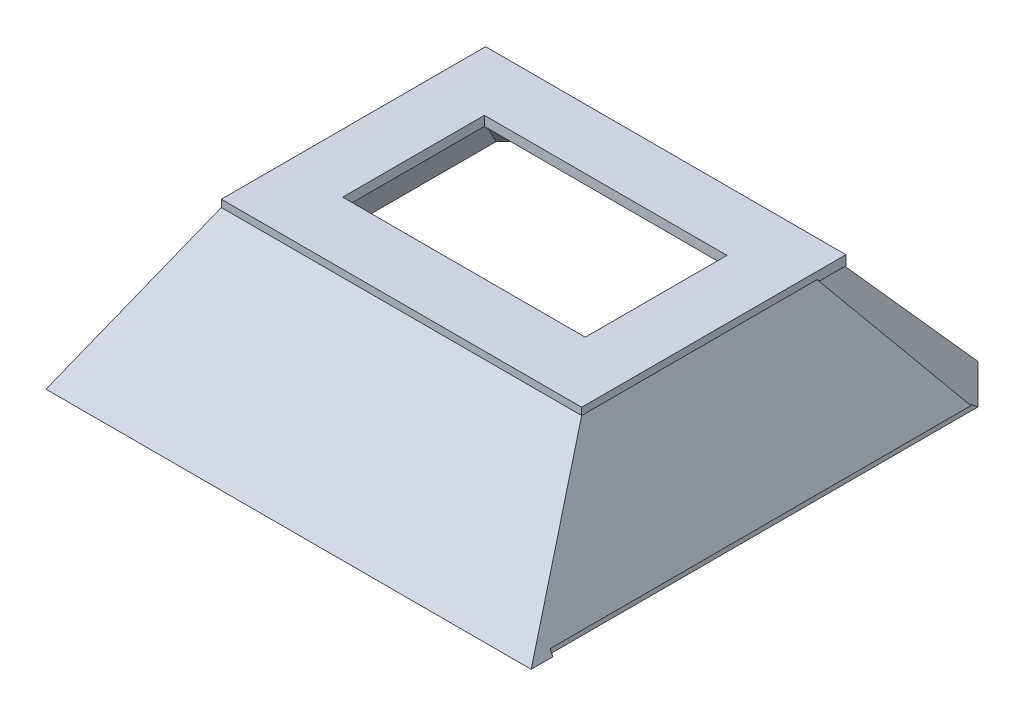
ISO-10303-21;
HEADER;
FILE_DESCRIPTION(('STEP AP214'),'2;1');
FILE_NAME('part.step','',(''),(''),'','','');
FILE_SCHEMA(('AUTOMOTIVE_DESIGN { 1 0 10303 214 1 1 1 1 }'));
ENDSEC;
DATA;
#1=APPLICATION_CONTEXT('core data for automotive mechanical design processes');
#2=APPLICATION_PROTOCOL_DEFINITION('international standard','automotive_design',2000,#1);
#3=PRODUCT_CONTEXT('',#1,'mechanical');
#4=PRODUCT('Part','Part','',(#3));
#5=PRODUCT_RELATED_PRODUCT_CATEGORY('part','',(#4));
#6=PRODUCT_DEFINITION_FORMATION('','',#4);
#7=PRODUCT_DEFINITION_CONTEXT('part definition',#1,'design');
#8=PRODUCT_DEFINITION('design','',#6,#7);
#9=PRODUCT_DEFINITION_SHAPE('','',#8);
#10=(LENGTH_UNIT() NAMED_UNIT(*) SI_UNIT(.MILLI.,.METRE.));
#11=(NAMED_UNIT(*) PLANE_ANGLE_UNIT() SI_UNIT($,.RADIAN.));
#12=(NAMED_UNIT(*) SI_UNIT($,.STERADIAN.) SOLID_ANGLE_UNIT());
#13=UNCERTAINTY_MEASURE_WITH_UNIT(LENGTH_MEASURE(1.E-05),#10,'distance_accuracy_value','');
#14=(GEOMETRIC_REPRESENTATION_CONTEXT(3) GLOBAL_UNCERTAINTY_ASSIGNED_CONTEXT((#13)) GLOBAL_UNIT_ASSIGNED_CONTEXT((#10,
#11,#12)) REPRESENTATION_CONTEXT('',''));
#15=CARTESIAN_POINT('',(0.,0.,0.));
#16=DIRECTION('',(0.,0.,1.));
#17=DIRECTION('',(1.,0.,0.));
#18=AXIS2_PLACEMENT_3D('',#15,#16,#17);
#19=CARTESIAN_POINT('',(82.5520129694677,39.0245879492029,0.));
#20=DIRECTION('',(-0.904072266505304,-0.427379616893416,0.));
#21=DIRECTION('',(0.427379616893416,-0.904072266505304,0.));
#22=AXIS2_PLACEMENT_3D('',#19,#20,#21);
#23=PLANE('',#22);
#24=DIRECTION('',(0.427379616893416,-0.904072266505304,0.));
#25=VECTOR('',#24,1.);
#26=CARTESIAN_POINT('',(82.5520129694677,39.0245879492029,-7.));
#27=LINE('',#26,#25);
#28=CARTESIAN_POINT('',(99.8654545454546,2.4,-7.));
#29=VERTEX_POINT('',#28);
#30=CARTESIAN_POINT('',(101.,0.,-7.));
#31=VERTEX_POINT('',#30);
#32=EDGE_CURVE('E12',#29,#31,#27,.T.);
#33=ORIENTED_EDGE('',*,*,#32,.F.);
#34=DIRECTION('',(0.,0.,1.));
#35=VECTOR('',#34,1.);
#36=CARTESIAN_POINT('',(99.8654545454546,2.4,0.));
#37=LINE('',#36,#35);
#38=CARTESIAN_POINT('',(99.8654545454545,2.4,-182.210909090909));
#39=VERTEX_POINT('',#38);
#40=EDGE_CURVE('E291',#39,#29,#37,.T.);
#41=ORIENTED_EDGE('',*,*,#40,.F.);
#42=DIRECTION('',(-0.354406355380797,0.74970575176707,0.558871560408179));
#43=VECTOR('',#42,1.);
#44=CARTESIAN_POINT('',(101.,0.,-184.));
#45=LINE('',#44,#43);
#46=CARTESIAN_POINT('',(75.,55.,-143.));
#47=VERTEX_POINT('',#46);
#48=EDGE_CURVE('E657',#39,#47,#45,.T.);
#49=ORIENTED_EDGE('',*,*,#48,.T.);
#50=DIRECTION('',(0.,0.,-1.));
#51=VECTOR('',#50,1.);
#52=CARTESIAN_POINT('',(75.,55.,-45.));
#53=LINE('',#52,#51);
#54=CARTESIAN_POINT('',(75.,55.,-45.));
#55=VERTEX_POINT('',#54);
#56=EDGE_CURVE('E823',#55,#47,#53,.T.);
#57=ORIENTED_EDGE('',*,*,#56,.F.);
#58=DIRECTION('',(-0.338204675761995,0.715432967958065,-0.611369990800528));
#59=VECTOR('',#58,1.);
#60=CARTESIAN_POINT('',(101.,0.,2.));
#61=LINE('',#60,#59);
#62=CARTESIAN_POINT('',(101.,0.,2.));
#63=VERTEX_POINT('',#62);
#64=EDGE_CURVE('E724',#63,#55,#61,.T.);
#65=ORIENTED_EDGE('',*,*,#64,.F.);
#66=DIRECTION('',(0.,0.,-1.));
#67=VECTOR('',#66,1.);
#68=CARTESIAN_POINT('',(101.,0.,2.));
#69=LINE('',#68,#67);
#70=EDGE_CURVE('E676',#63,#31,#69,.T.);
#71=ORIENTED_EDGE('',*,*,#70,.T.);
#72=EDGE_LOOP('',(#33,#41,#49,#57,#65,#71));
#73=FACE_BOUND('',#72,.T.);
#74=ADVANCED_FACE('F52',(#73),#23,.F.);
#75=CARTESIAN_POINT('',(81.8033020210645,99.6512951892969,-81.8033020210648));
#76=DIRECTION('',(-0.535750996171235,-0.652642122608597,0.535750996171237));
#77=DIRECTION('',(0.,-0.634493378388243,-0.772928297309313));
#78=AXIS2_PLACEMENT_3D('',#75,#76,#77);
#79=PLANE('',#78);
#80=DIRECTION('',(0.,0.634493378388243,0.772928297309313));
#81=VECTOR('',#80,1.);
#82=CARTESIAN_POINT('',(99.4,91.0215597551238,-74.7191908437584));
#83=LINE('',#82,#81);
#84=CARTESIAN_POINT('',(99.4,0.,-185.6));
#85=VERTEX_POINT('',#84);
#86=CARTESIAN_POINT('',(99.4,2.4,-182.676363636364));
#87=VERTEX_POINT('',#86);
#88=EDGE_CURVE('E61',#85,#87,#83,.T.);
#89=ORIENTED_EDGE('',*,*,#88,.F.);
#90=DIRECTION('',(-0.707106781186549,0.,-0.707106781186546));
#91=VECTOR('',#90,1.);
#92=CARTESIAN_POINT('',(101.,0.,-184.));
#93=LINE('',#92,#91);
#94=CARTESIAN_POINT('',(83.,0.,-202.));
#95=VERTEX_POINT('',#94);
#96=EDGE_CURVE('E59',#85,#95,#93,.T.);
#97=ORIENTED_EDGE('',*,*,#96,.T.);
#98=DIRECTION('',(-0.266453588992477,0.732747369729312,0.626165934132322));
#99=VECTOR('',#98,1.);
#100=CARTESIAN_POINT('',(83.,0.,-202.));
#101=LINE('',#100,#99);
#102=CARTESIAN_POINT('',(63.,55.,-155.));
#103=VERTEX_POINT('',#102);
#104=EDGE_CURVE('E726',#95,#103,#101,.T.);
#105=ORIENTED_EDGE('',*,*,#104,.T.);
#106=DIRECTION('',(0.772928297309314,-0.634493378388242,0.));
#107=VECTOR('',#106,1.);
#108=CARTESIAN_POINT('',(52.3356401384082,63.7543252595156,-155.));
#109=LINE('',#108,#107);
#110=CARTESIAN_POINT('',(64.2181818181817,54.,-155.));
#111=VERTEX_POINT('',#110);
#112=EDGE_CURVE('E459',#103,#111,#109,.T.);
#113=ORIENTED_EDGE('',*,*,#112,.T.);
#114=DIRECTION('',(0.707106781186549,0.,0.707106781186546));
#115=VECTOR('',#114,1.);
#116=CARTESIAN_POINT('',(109.609090909091,54.,-109.609090909091));
#117=LINE('',#116,#115);
#118=CARTESIAN_POINT('',(75.,54.,-144.218181818182));
#119=VERTEX_POINT('',#118);
#120=EDGE_CURVE('E413',#111,#119,#117,.T.);
#121=ORIENTED_EDGE('',*,*,#120,.T.);
#122=DIRECTION('',(0.,0.634493378388243,0.772928297309313));
#123=VECTOR('',#122,1.);
#124=CARTESIAN_POINT('',(75.,102.987756188448,-84.5421879158904));
#125=LINE('',#124,#123);
#126=EDGE_CURVE('E757',#119,#47,#125,.T.);
#127=ORIENTED_EDGE('',*,*,#126,.T.);
#128=ORIENTED_EDGE('',*,*,#48,.F.);
#129=DIRECTION('',(0.707106781186549,0.,0.707106781186546));
#130=VECTOR('',#129,1.);
#131=CARTESIAN_POINT('',(141.038181818182,2.4,-141.038181818182));
#132=LINE('',#131,#130);
#133=EDGE_CURVE('E648',#87,#39,#132,.T.);
#134=ORIENTED_EDGE('',*,*,#133,.F.);
#135=EDGE_LOOP('',(#89,#97,#105,#113,#121,#127,#128,#134));
#136=FACE_BOUND('',#135,.T.);
#137=ADVANCED_FACE('F534',(#136),#79,.F.);
#138=CARTESIAN_POINT('',(0.,99.7649980894153,-116.746274359954));
#139=DIRECTION('',(0.,-0.649652327582146,0.760231447170597));
#140=DIRECTION('',(0.,-0.760231447170597,-0.649652327582146));
#141=AXIS2_PLACEMENT_3D('',#138,#139,#140);
#142=PLANE('',#141);
#143=DIRECTION('',(0.,0.760231447170597,0.649652327582146));
#144=VECTOR('',#143,1.);
#145=CARTESIAN_POINT('',(-82.126101954772,99.7649980894153,-116.746274359954));
#146=LINE('',#145,#144);
#147=CARTESIAN_POINT('',(-82.126101954772,0.,-202.));
#148=VERTEX_POINT('',#147);
#149=CARTESIAN_POINT('',(-82.126101954772,2.4,-199.949090909091));
#150=VERTEX_POINT('',#149);
#151=EDGE_CURVE('E321',#148,#150,#146,.T.);
#152=ORIENTED_EDGE('',*,*,#151,.F.);
#153=DIRECTION('',(-1.,0.,0.));
#154=VECTOR('',#153,1.);
#155=CARTESIAN_POINT('',(83.,0.,-202.));
#156=LINE('',#155,#154);
#157=CARTESIAN_POINT('',(-83.,0.,-202.));
#158=VERTEX_POINT('',#157);
#159=EDGE_CURVE('E608',#148,#158,#156,.T.);
#160=ORIENTED_EDGE('',*,*,#159,.T.);
#161=DIRECTION('',(0.266453588992477,0.732747369729312,0.626165934132321));
#162=VECTOR('',#161,1.);
#163=CARTESIAN_POINT('',(-83.,0.,-202.));
#164=LINE('',#163,#162);
#165=CARTESIAN_POINT('',(-63.,55.,-155.));
#166=VERTEX_POINT('',#165);
#167=EDGE_CURVE('E711',#158,#166,#164,.T.);
#168=ORIENTED_EDGE('',*,*,#167,.T.);
#169=DIRECTION('',(-1.,0.,0.));
#170=VECTOR('',#169,1.);
#171=CARTESIAN_POINT('',(63.,55.,-155.));
#172=LINE('',#171,#170);
#173=EDGE_CURVE('E469',#103,#166,#172,.T.);
#174=ORIENTED_EDGE('',*,*,#173,.F.);
#175=ORIENTED_EDGE('',*,*,#104,.F.);
#176=CARTESIAN_POINT('',(82.,0.,-202.));
#177=VERTEX_POINT('',#176);
#178=EDGE_CURVE('E658',#95,#177,#156,.T.);
#179=ORIENTED_EDGE('',*,*,#178,.T.);
#180=DIRECTION('',(0.,-0.760231447170597,-0.649652327582146));
#181=VECTOR('',#180,1.);
#182=CARTESIAN_POINT('',(82.,99.7649980894153,-116.746274359954));
#183=LINE('',#182,#181);
#184=CARTESIAN_POINT('',(82.,2.4,-199.949090909091));
#185=VERTEX_POINT('',#184);
#186=EDGE_CURVE('E750',#185,#177,#183,.T.);
#187=ORIENTED_EDGE('',*,*,#186,.F.);
#188=DIRECTION('',(1.,0.,0.));
#189=VECTOR('',#188,1.);
#190=CARTESIAN_POINT('',(0.,2.4,-199.949090909091));
#191=LINE('',#190,#189);
#192=EDGE_CURVE('E619',#150,#185,#191,.T.);
#193=ORIENTED_EDGE('',*,*,#192,.F.);
#194=EDGE_LOOP('',(#152,#160,#168,#174,#175,#179,#187,#193));
#195=FACE_BOUND('',#194,.T.);
#196=ADVANCED_FACE('F539',(#195),#142,.F.);
#197=CARTESIAN_POINT('',(-81.8033020210647,99.6512951892968,-81.8033020210645));
#198=DIRECTION('',(0.535750996171238,-0.652642122608597,0.535750996171236));
#199=DIRECTION('',(0.772928297309313,0.634493378388243,0.));
#200=AXIS2_PLACEMENT_3D('',#197,#198,#199);
#201=PLANE('',#200);
#202=DIRECTION('',(0.,-0.634493378388242,-0.772928297309314));
#203=VECTOR('',#202,1.);
#204=CARTESIAN_POINT('',(-99.4,91.0215597551237,-74.7191908437582));
#205=LINE('',#204,#203);
#206=CARTESIAN_POINT('',(-99.4,2.40000000000001,-182.676363636364));
#207=VERTEX_POINT('',#206);
#208=CARTESIAN_POINT('',(-99.4,0.,-185.6));
#209=VERTEX_POINT('',#208);
#210=EDGE_CURVE('E751',#207,#209,#205,.T.);
#211=ORIENTED_EDGE('',*,*,#210,.F.);
#212=DIRECTION('',(0.707106781186546,0.,-0.707106781186549));
#213=VECTOR('',#212,1.);
#214=CARTESIAN_POINT('',(-141.038181818182,2.40000000000001,-141.038181818181));
#215=LINE('',#214,#213);
#216=CARTESIAN_POINT('',(-99.8654545454546,2.4,-182.210909090909));
#217=VERTEX_POINT('',#216);
#218=EDGE_CURVE('E280',#217,#207,#215,.T.);
#219=ORIENTED_EDGE('',*,*,#218,.F.);
#220=DIRECTION('',(0.354406355380797,0.74970575176707,0.558871560408179));
#221=VECTOR('',#220,1.);
#222=CARTESIAN_POINT('',(-101.,0.,-184.));
#223=LINE('',#222,#221);
#224=CARTESIAN_POINT('',(-75.,55.,-143.));
#225=VERTEX_POINT('',#224);
#226=EDGE_CURVE('E708',#217,#225,#223,.T.);
#227=ORIENTED_EDGE('',*,*,#226,.T.);
#228=DIRECTION('',(0.,-0.634493378388242,-0.772928297309314));
#229=VECTOR('',#228,1.);
#230=CARTESIAN_POINT('',(-75.,102.987756188448,-84.5421879158902));
#231=LINE('',#230,#229);
#232=CARTESIAN_POINT('',(-75.,54.,-144.218181818182));
#233=VERTEX_POINT('',#232);
#234=EDGE_CURVE('E454',#225,#233,#231,.T.);
#235=ORIENTED_EDGE('',*,*,#234,.T.);
#236=DIRECTION('',(0.707106781186546,0.,-0.707106781186549));
#237=VECTOR('',#236,1.);
#238=CARTESIAN_POINT('',(-109.609090909091,54.,-109.609090909091));
#239=LINE('',#238,#237);
#240=CARTESIAN_POINT('',(-64.2181818181818,54.,-155.));
#241=VERTEX_POINT('',#240);
#242=EDGE_CURVE('E846',#233,#241,#239,.T.);
#243=ORIENTED_EDGE('',*,*,#242,.T.);
#244=DIRECTION('',(0.772928297309313,0.634493378388243,0.));
#245=VECTOR('',#244,1.);
#246=CARTESIAN_POINT('',(-52.3356401384084,63.7543252595155,-155.));
#247=LINE('',#246,#245);
#248=EDGE_CURVE('E837',#241,#166,#247,.T.);
#249=ORIENTED_EDGE('',*,*,#248,.T.);
#250=ORIENTED_EDGE('',*,*,#167,.F.);
#251=DIRECTION('',(-0.707106781186546,0.,0.707106781186549));
#252=VECTOR('',#251,1.);
#253=CARTESIAN_POINT('',(-83.,0.,-202.));
#254=LINE('',#253,#252);
#255=EDGE_CURVE('E654',#158,#209,#254,.T.);
#256=ORIENTED_EDGE('',*,*,#255,.T.);
#257=EDGE_LOOP('',(#211,#219,#227,#235,#243,#249,#250,#256));
#258=FACE_BOUND('',#257,.T.);
#259=ADVANCED_FACE('F590',(#258),#201,.F.);
#260=CARTESIAN_POINT('',(-82.5520129694677,39.0245879492029,0.));
#261=DIRECTION('',(0.904072266505304,-0.427379616893416,0.));
#262=DIRECTION('',(0.427379616893416,0.904072266505304,0.));
#263=AXIS2_PLACEMENT_3D('',#260,#261,#262);
#264=PLANE('',#263);
#265=DIRECTION('',(0.427379616893416,0.904072266505304,0.));
#266=VECTOR('',#265,1.);
#267=CARTESIAN_POINT('',(-82.5520129694677,39.0245879492029,-7.));
#268=LINE('',#267,#266);
#269=CARTESIAN_POINT('',(-101.,0.,-7.));
#270=VERTEX_POINT('',#269);
#271=CARTESIAN_POINT('',(-99.8654545454546,2.4,-7.));
#272=VERTEX_POINT('',#271);
#273=EDGE_CURVE('E262',#270,#272,#268,.T.);
#274=ORIENTED_EDGE('',*,*,#273,.F.);
#275=DIRECTION('',(0.,0.,1.));
#276=VECTOR('',#275,1.);
#277=CARTESIAN_POINT('',(-101.,0.,-184.));
#278=LINE('',#277,#276);
#279=CARTESIAN_POINT('',(-101.,0.,2.));
#280=VERTEX_POINT('',#279);
#281=EDGE_CURVE('E659',#270,#280,#278,.T.);
#282=ORIENTED_EDGE('',*,*,#281,.T.);
#283=DIRECTION('',(0.338204675761995,0.715432967958065,-0.611369990800528));
#284=VECTOR('',#283,1.);
#285=CARTESIAN_POINT('',(-101.,0.,2.));
#286=LINE('',#285,#284);
#287=CARTESIAN_POINT('',(-75.,55.,-45.));
#288=VERTEX_POINT('',#287);
#289=EDGE_CURVE('E702',#280,#288,#286,.T.);
#290=ORIENTED_EDGE('',*,*,#289,.T.);
#291=DIRECTION('',(0.,0.,1.));
#292=VECTOR('',#291,1.);
#293=CARTESIAN_POINT('',(-75.,55.,-143.));
#294=LINE('',#293,#292);
#295=EDGE_CURVE('E710',#225,#288,#294,.T.);
#296=ORIENTED_EDGE('',*,*,#295,.F.);
#297=ORIENTED_EDGE('',*,*,#226,.F.);
#298=DIRECTION('',(0.,0.,-1.));
#299=VECTOR('',#298,1.);
#300=CARTESIAN_POINT('',(-99.8654545454546,2.4,0.));
#301=LINE('',#300,#299);
#302=EDGE_CURVE('E754',#272,#217,#301,.T.);
#303=ORIENTED_EDGE('',*,*,#302,.F.);
#304=EDGE_LOOP('',(#274,#282,#290,#296,#297,#303));
#305=FACE_BOUND('',#304,.T.);
#306=ADVANCED_FACE('F54',(#305),#264,.F.);
#307=CARTESIAN_POINT('',(0.,0.,0.));
#308=DIRECTION('',(0.,1.,0.));
#309=DIRECTION('',(0.,0.,1.));
#310=AXIS2_PLACEMENT_3D('',#307,#308,#309);
#311=PLANE('',#310);
#312=DIRECTION('',(1.,0.,0.));
#313=VECTOR('',#312,1.);
#314=CARTESIAN_POINT('',(-102.6,0.,-7.));
#315=LINE('',#314,#313);
#316=CARTESIAN_POINT('',(-99.4,0.,-7.));
#317=VERTEX_POINT('',#316);
#318=EDGE_CURVE('E289',#270,#317,#315,.T.);
#319=ORIENTED_EDGE('',*,*,#318,.T.);
#320=DIRECTION('',(0.,0.,-1.));
#321=VECTOR('',#320,1.);
#322=CARTESIAN_POINT('',(-99.4,0.,-7.));
#323=LINE('',#322,#321);
#324=EDGE_CURVE('E267',#317,#209,#323,.T.);
#325=ORIENTED_EDGE('',*,*,#324,.T.);
#326=ORIENTED_EDGE('',*,*,#255,.F.);
#327=ORIENTED_EDGE('',*,*,#159,.F.);
#328=DIRECTION('',(0.,0.,1.));
#329=VECTOR('',#328,1.);
#330=CARTESIAN_POINT('',(-82.126101954772,0.,-199.946339593714));
#331=LINE('',#330,#329);
#332=CARTESIAN_POINT('',(-82.126101954772,0.,-199.946339593714));
#333=VERTEX_POINT('',#332);
#334=EDGE_CURVE('E296',#148,#333,#331,.T.);
#335=ORIENTED_EDGE('',*,*,#334,.T.);
#336=DIRECTION('',(1.,0.,0.));
#337=VECTOR('',#336,1.);
#338=CARTESIAN_POINT('',(-82.126101954772,0.,-199.946339593714));
#339=LINE('',#338,#337);
#340=CARTESIAN_POINT('',(82.,0.,-199.946339593714));
#341=VERTEX_POINT('',#340);
#342=EDGE_CURVE('E299',#333,#341,#339,.T.);
#343=ORIENTED_EDGE('',*,*,#342,.T.);
#344=DIRECTION('',(0.,0.,-1.));
#345=VECTOR('',#344,1.);
#346=CARTESIAN_POINT('',(82.,0.,-199.946339593714));
#347=LINE('',#346,#345);
#348=EDGE_CURVE('E294',#341,#177,#347,.T.);
#349=ORIENTED_EDGE('',*,*,#348,.T.);
#350=ORIENTED_EDGE('',*,*,#178,.F.);
#351=ORIENTED_EDGE('',*,*,#96,.F.);
#352=DIRECTION('',(0.,0.,1.));
#353=VECTOR('',#352,1.);
#354=CARTESIAN_POINT('',(99.4,0.,-7.));
#355=LINE('',#354,#353);
#356=CARTESIAN_POINT('',(99.4,0.,-7.));
#357=VERTEX_POINT('',#356);
#358=EDGE_CURVE('E286',#85,#357,#355,.T.);
#359=ORIENTED_EDGE('',*,*,#358,.T.);
#360=DIRECTION('',(1.,0.,0.));
#361=VECTOR('',#360,1.);
#362=CARTESIAN_POINT('',(99.4,0.,-7.));
#363=LINE('',#362,#361);
#364=EDGE_CURVE('E329',#357,#31,#363,.T.);
#365=ORIENTED_EDGE('',*,*,#364,.T.);
#366=ORIENTED_EDGE('',*,*,#70,.F.);
#367=DIRECTION('',(1.,0.,0.));
#368=VECTOR('',#367,1.);
#369=CARTESIAN_POINT('',(-101.,0.,2.));
#370=LINE('',#369,#368);
#371=EDGE_CURVE('E665',#280,#63,#370,.T.);
#372=ORIENTED_EDGE('',*,*,#371,.F.);
#373=ORIENTED_EDGE('',*,*,#281,.F.);
#374=EDGE_LOOP('',(#319,#325,#326,#327,#335,#343,#349,#350,#351,#359,#365,#366,#372,#373));
#375=FACE_BOUND('',#374,.T.);
#376=DIRECTION('',(-0.707106781186546,0.,0.707106781186549));
#377=VECTOR('',#376,1.);
#378=CARTESIAN_POINT('',(-138.766922480232,0.,-138.766922480232));
#379=LINE('',#378,#377);
#380=CARTESIAN_POINT('',(-80.7954005234277,0.,-196.738444437037));
#381=VERTEX_POINT('',#380);
#382=CARTESIAN_POINT('',(-96.5755749311258,0.,-180.958270029339));
#383=VERTEX_POINT('',#382);
#384=EDGE_CURVE('E787',#381,#383,#379,.T.);
#385=ORIENTED_EDGE('',*,*,#384,.T.);
#386=DIRECTION('',(0.,0.,1.));
#387=VECTOR('',#386,1.);
#388=CARTESIAN_POINT('',(-96.5755749311258,0.,0.));
#389=LINE('',#388,#387);
#390=CARTESIAN_POINT('',(-96.5755749311258,0.,-3.26155556296318));
#391=VERTEX_POINT('',#390);
#392=EDGE_CURVE('E788',#383,#391,#389,.T.);
#393=ORIENTED_EDGE('',*,*,#392,.T.);
#394=DIRECTION('',(1.,0.,0.));
#395=VECTOR('',#394,1.);
#396=CARTESIAN_POINT('',(0.,0.,-3.26155556296318));
#397=LINE('',#396,#395);
#398=CARTESIAN_POINT('',(96.5755749311258,0.,-3.26155556296318));
#399=VERTEX_POINT('',#398);
#400=EDGE_CURVE('E794',#391,#399,#397,.T.);
#401=ORIENTED_EDGE('',*,*,#400,.T.);
#402=DIRECTION('',(0.,0.,-1.));
#403=VECTOR('',#402,1.);
#404=CARTESIAN_POINT('',(96.5755749311258,0.,0.));
#405=LINE('',#404,#403);
#406=CARTESIAN_POINT('',(96.5755749311258,0.,-180.958270029339));
#407=VERTEX_POINT('',#406);
#408=EDGE_CURVE('E782',#399,#407,#405,.T.);
#409=ORIENTED_EDGE('',*,*,#408,.T.);
#410=DIRECTION('',(-0.707106781186549,0.,-0.707106781186546));
#411=VECTOR('',#410,1.);
#412=CARTESIAN_POINT('',(138.766922480232,0.,-138.766922480233));
#413=LINE('',#412,#411);
#414=CARTESIAN_POINT('',(80.7954005234277,0.,-196.738444437037));
#415=VERTEX_POINT('',#414);
#416=EDGE_CURVE('E776',#407,#415,#413,.T.);
#417=ORIENTED_EDGE('',*,*,#416,.T.);
#418=DIRECTION('',(-1.,0.,0.));
#419=VECTOR('',#418,1.);
#420=CARTESIAN_POINT('',(0.,0.,-196.738444437037));
#421=LINE('',#420,#419);
#422=EDGE_CURVE('E784',#415,#381,#421,.T.);
#423=ORIENTED_EDGE('',*,*,#422,.T.);
#424=EDGE_LOOP('',(#385,#393,#401,#409,#417,#423));
#425=FACE_BOUND('',#424,.T.);
#426=ADVANCED_FACE('F550',(#375,#425),#311,.F.);
#427=CARTESIAN_POINT('',(0.,0.987772258311042,1.1559037065342));
#428=DIRECTION('',(0.,-0.649652327582146,-0.760231447170597));
#429=DIRECTION('',(0.,0.760231447170597,-0.649652327582146));
#430=AXIS2_PLACEMENT_3D('',#427,#428,#429);
#431=PLANE('',#430);
#432=ORIENTED_EDGE('',*,*,#64,.T.);
#433=DIRECTION('',(1.,0.,0.));
#434=VECTOR('',#433,1.);
#435=CARTESIAN_POINT('',(-75.,55.,-45.));
#436=LINE('',#435,#434);
#437=EDGE_CURVE('E420',#288,#55,#436,.T.);
#438=ORIENTED_EDGE('',*,*,#437,.F.);
#439=ORIENTED_EDGE('',*,*,#289,.F.);
#440=ORIENTED_EDGE('',*,*,#371,.T.);
#441=EDGE_LOOP('',(#432,#438,#439,#440));
#442=FACE_BOUND('',#441,.T.);
#443=ADVANCED_FACE('F549',(#442),#431,.F.);
#444=CARTESIAN_POINT('',(78.9357239034465,37.3150694816293,0.));
#445=DIRECTION('',(-0.904072266505304,-0.427379616893416,0.));
#446=DIRECTION('',(0.427379616893416,-0.904072266505304,0.));
#447=AXIS2_PLACEMENT_3D('',#444,#445,#446);
#448=PLANE('',#447);
#449=DIRECTION('',(0.,0.,1.));
#450=VECTOR('',#449,1.);
#451=CARTESIAN_POINT('',(71.0483022038531,54.,0.));
#452=LINE('',#451,#450);
#453=CARTESIAN_POINT('',(71.0483022038531,54.,-140.703724574793));
#454=VERTEX_POINT('',#453);
#455=CARTESIAN_POINT('',(71.0483022038531,54.,-49.4070101084177));
#456=VERTEX_POINT('',#455);
#457=EDGE_CURVE('E848',#454,#456,#452,.T.);
#458=ORIENTED_EDGE('',*,*,#457,.F.);
#459=DIRECTION('',(-0.354406355380797,0.74970575176707,0.558871560408179));
#460=VECTOR('',#459,1.);
#461=CARTESIAN_POINT('',(48.6033332914535,101.479741930076,-105.309735136009));
#462=LINE('',#461,#460);
#463=EDGE_CURVE('E789',#407,#454,#462,.T.);
#464=ORIENTED_EDGE('',*,*,#463,.F.);
#465=ORIENTED_EDGE('',*,*,#408,.F.);
#466=DIRECTION('',(-0.338204675761995,0.715432967958065,-0.611369990800528));
#467=VECTOR('',#466,1.);
#468=CARTESIAN_POINT('',(86.203414566405,21.9411084638325,-22.0112300684201));
#469=LINE('',#468,#467);
#470=EDGE_CURVE('E802',#399,#456,#469,.T.);
#471=ORIENTED_EDGE('',*,*,#470,.T.);
#472=EDGE_LOOP('',(#458,#464,#465,#471));
#473=FACE_BOUND('',#472,.T.);
#474=ADVANCED_FACE('F450',(#473),#448,.T.);
#475=CARTESIAN_POINT('',(0.,-1.61083705201754,-1.88502208214819));
#476=DIRECTION('',(0.,-0.649652327582146,-0.760231447170597));
#477=DIRECTION('',(0.,0.760231447170597,-0.649652327582146));
#478=AXIS2_PLACEMENT_3D('',#475,#476,#477);
#479=PLANE('',#478);
#480=DIRECTION('',(-1.,0.,0.));
#481=VECTOR('',#480,1.);
#482=CARTESIAN_POINT('',(0.,54.,-49.4070101084177));
#483=LINE('',#482,#481);
#484=CARTESIAN_POINT('',(-71.0483022038531,54.,-49.4070101084177));
#485=VERTEX_POINT('',#484);
#486=EDGE_CURVE('E852',#456,#485,#483,.T.);
#487=ORIENTED_EDGE('',*,*,#486,.F.);
#488=ORIENTED_EDGE('',*,*,#470,.F.);
#489=ORIENTED_EDGE('',*,*,#400,.F.);
#490=DIRECTION('',(0.338204675761995,0.715432967958065,-0.611369990800528));
#491=VECTOR('',#490,1.);
#492=CARTESIAN_POINT('',(-86.203414566405,21.9411084638325,-22.01123006842));
#493=LINE('',#492,#491);
#494=EDGE_CURVE('E664',#391,#485,#493,.T.);
#495=ORIENTED_EDGE('',*,*,#494,.T.);
#496=EDGE_LOOP('',(#487,#488,#489,#495));
#497=FACE_BOUND('',#496,.T.);
#498=ADVANCED_FACE('F878',(#497),#479,.T.);
#499=CARTESIAN_POINT('',(79.6602980363795,97.0407266988625,-79.6602980363798));
#500=DIRECTION('',(-0.535750996171235,-0.652642122608597,0.535750996171237));
#501=DIRECTION('',(0.,-0.634493378388243,-0.772928297309313));
#502=AXIS2_PLACEMENT_3D('',#499,#500,#501);
#503=PLANE('',#502);
#504=DIRECTION('',(0.707106781186549,0.,0.707106781186546));
#505=VECTOR('',#504,1.);
#506=CARTESIAN_POINT('',(105.876013389323,54.,-105.876013389323));
#507=LINE('',#506,#505);
#508=CARTESIAN_POINT('',(61.1590368870641,54.,-150.592989891582));
#509=VERTEX_POINT('',#508);
#510=EDGE_CURVE('E856',#509,#454,#507,.T.);
#511=ORIENTED_EDGE('',*,*,#510,.F.);
#512=DIRECTION('',(-0.266453588992477,0.732747369729312,0.626165934132321));
#513=VECTOR('',#512,1.);
#514=CARTESIAN_POINT('',(42.2344672646088,106.042566461752,-106.120251278812));
#515=LINE('',#514,#513);
#516=EDGE_CURVE('E797',#415,#509,#515,.T.);
#517=ORIENTED_EDGE('',*,*,#516,.F.);
#518=ORIENTED_EDGE('',*,*,#416,.F.);
#519=ORIENTED_EDGE('',*,*,#463,.T.);
#520=EDGE_LOOP('',(#511,#517,#518,#519));
#521=FACE_BOUND('',#520,.T.);
#522=ADVANCED_FACE('F876',(#521),#503,.T.);
#523=CARTESIAN_POINT('',(0.,97.1663887790867,-113.705348571272));
#524=DIRECTION('',(0.,-0.649652327582146,0.760231447170597));
#525=DIRECTION('',(0.,-0.760231447170597,-0.649652327582146));
#526=AXIS2_PLACEMENT_3D('',#523,#524,#525);
#527=PLANE('',#526);
#528=DIRECTION('',(1.,0.,0.));
#529=VECTOR('',#528,1.);
#530=CARTESIAN_POINT('',(0.,54.,-150.592989891582));
#531=LINE('',#530,#529);
#532=CARTESIAN_POINT('',(-61.1590368870641,54.,-150.592989891582));
#533=VERTEX_POINT('',#532);
#534=EDGE_CURVE('E863',#533,#509,#531,.T.);
#535=ORIENTED_EDGE('',*,*,#534,.F.);
#536=DIRECTION('',(0.266453588992477,0.732747369729312,0.626165934132322));
#537=VECTOR('',#536,1.);
#538=CARTESIAN_POINT('',(-42.2344672646089,106.042566461752,-106.120251278812));
#539=LINE('',#538,#537);
#540=EDGE_CURVE('E803',#381,#533,#539,.T.);
#541=ORIENTED_EDGE('',*,*,#540,.F.);
#542=ORIENTED_EDGE('',*,*,#422,.F.);
#543=ORIENTED_EDGE('',*,*,#516,.T.);
#544=EDGE_LOOP('',(#535,#541,#542,#543));
#545=FACE_BOUND('',#544,.T.);
#546=ADVANCED_FACE('F871',(#545),#527,.T.);
#547=CARTESIAN_POINT('',(-79.6602980363798,97.0407266988624,-79.6602980363795));
#548=DIRECTION('',(0.535750996171238,-0.652642122608597,0.535750996171236));
#549=DIRECTION('',(0.772928297309313,0.634493378388243,0.));
#550=AXIS2_PLACEMENT_3D('',#547,#548,#549);
#551=PLANE('',#550);
#552=DIRECTION('',(0.707106781186546,0.,-0.707106781186549));
#553=VECTOR('',#552,1.);
#554=CARTESIAN_POINT('',(-105.876013389323,54.,-105.876013389323));
#555=LINE('',#554,#553);
#556=CARTESIAN_POINT('',(-71.0483022038531,54.,-140.703724574793));
#557=VERTEX_POINT('',#556);
#558=EDGE_CURVE('E396',#557,#533,#555,.T.);
#559=ORIENTED_EDGE('',*,*,#558,.F.);
#560=DIRECTION('',(0.354406355380797,0.74970575176707,0.558871560408179));
#561=VECTOR('',#560,1.);
#562=CARTESIAN_POINT('',(-48.6033332914535,101.479741930076,-105.309735136009));
#563=LINE('',#562,#561);
#564=EDGE_CURVE('E804',#383,#557,#563,.T.);
#565=ORIENTED_EDGE('',*,*,#564,.F.);
#566=ORIENTED_EDGE('',*,*,#384,.F.);
#567=ORIENTED_EDGE('',*,*,#540,.T.);
#568=EDGE_LOOP('',(#559,#565,#566,#567));
#569=FACE_BOUND('',#568,.T.);
#570=ADVANCED_FACE('F870',(#569),#551,.T.);
#571=CARTESIAN_POINT('',(-78.9357239034465,37.3150694816293,0.));
#572=DIRECTION('',(0.904072266505304,-0.427379616893416,0.));
#573=DIRECTION('',(0.427379616893416,0.904072266505304,0.));
#574=AXIS2_PLACEMENT_3D('',#571,#572,#573);
#575=PLANE('',#574);
#576=DIRECTION('',(0.,0.,-1.));
#577=VECTOR('',#576,1.);
#578=CARTESIAN_POINT('',(-71.0483022038531,54.,0.));
#579=LINE('',#578,#577);
#580=EDGE_CURVE('E829',#485,#557,#579,.T.);
#581=ORIENTED_EDGE('',*,*,#580,.F.);
#582=ORIENTED_EDGE('',*,*,#494,.F.);
#583=ORIENTED_EDGE('',*,*,#392,.F.);
#584=ORIENTED_EDGE('',*,*,#564,.T.);
#585=EDGE_LOOP('',(#581,#582,#583,#584));
#586=FACE_BOUND('',#585,.T.);
#587=ADVANCED_FACE('F885',(#586),#575,.T.);
#588=CARTESIAN_POINT('',(75.,54.,-45.));
#589=DIRECTION('',(1.,0.,0.));
#590=DIRECTION('',(0.,0.,-1.));
#591=AXIS2_PLACEMENT_3D('',#588,#589,#590);
#592=PLANE('',#591);
#593=ORIENTED_EDGE('',*,*,#56,.T.);
#594=ORIENTED_EDGE('',*,*,#126,.F.);
#595=DIRECTION('',(0.,0.,-1.));
#596=VECTOR('',#595,1.);
#597=CARTESIAN_POINT('',(75.,54.,-45.));
#598=LINE('',#597,#596);
#599=CARTESIAN_POINT('',(75.,54.,-155.));
#600=VERTEX_POINT('',#599);
#601=EDGE_CURVE('E392',#119,#600,#598,.T.);
#602=ORIENTED_EDGE('',*,*,#601,.T.);
#603=DIRECTION('',(0.,1.,0.));
#604=VECTOR('',#603,1.);
#605=CARTESIAN_POINT('',(75.,54.,-155.));
#606=LINE('',#605,#604);
#607=CARTESIAN_POINT('',(75.,58.,-155.));
#608=VERTEX_POINT('',#607);
#609=EDGE_CURVE('E402',#600,#608,#606,.T.);
#610=ORIENTED_EDGE('',*,*,#609,.T.);
#611=DIRECTION('',(0.,0.,-1.));
#612=VECTOR('',#611,1.);
#613=CARTESIAN_POINT('',(75.,58.,-45.));
#614=LINE('',#613,#612);
#615=CARTESIAN_POINT('',(75.,58.,-45.));
#616=VERTEX_POINT('',#615);
#617=EDGE_CURVE('E362',#616,#608,#614,.T.);
#618=ORIENTED_EDGE('',*,*,#617,.F.);
#619=DIRECTION('',(0.,1.,0.));
#620=VECTOR('',#619,1.);
#621=CARTESIAN_POINT('',(75.,54.,-45.));
#622=LINE('',#621,#620);
#623=EDGE_CURVE('E401',#55,#616,#622,.T.);
#624=ORIENTED_EDGE('',*,*,#623,.F.);
#625=EDGE_LOOP('',(#593,#594,#602,#610,#618,#624));
#626=FACE_BOUND('',#625,.T.);
#627=ADVANCED_FACE('F438',(#626),#592,.T.);
#628=CARTESIAN_POINT('',(-75.,54.,-155.));
#629=DIRECTION('',(0.,0.,-1.));
#630=DIRECTION('',(-1.,0.,0.));
#631=AXIS2_PLACEMENT_3D('',#628,#629,#630);
#632=PLANE('',#631);
#633=ORIENTED_EDGE('',*,*,#112,.F.);
#634=ORIENTED_EDGE('',*,*,#173,.T.);
#635=ORIENTED_EDGE('',*,*,#248,.F.);
#636=DIRECTION('',(-1.,0.,0.));
#637=VECTOR('',#636,1.);
#638=CARTESIAN_POINT('',(-75.,54.,-155.));
#639=LINE('',#638,#637);
#640=CARTESIAN_POINT('',(-75.,54.,-155.));
#641=VERTEX_POINT('',#640);
#642=EDGE_CURVE('E394',#241,#641,#639,.T.);
#643=ORIENTED_EDGE('',*,*,#642,.T.);
#644=DIRECTION('',(0.,1.,0.));
#645=VECTOR('',#644,1.);
#646=CARTESIAN_POINT('',(-75.,54.,-155.));
#647=LINE('',#646,#645);
#648=CARTESIAN_POINT('',(-75.,58.,-155.));
#649=VERTEX_POINT('',#648);
#650=EDGE_CURVE('E397',#641,#649,#647,.T.);
#651=ORIENTED_EDGE('',*,*,#650,.T.);
#652=DIRECTION('',(-1.,0.,0.));
#653=VECTOR('',#652,1.);
#654=CARTESIAN_POINT('',(-75.,58.,-155.));
#655=LINE('',#654,#653);
#656=EDGE_CURVE('E364',#608,#649,#655,.T.);
#657=ORIENTED_EDGE('',*,*,#656,.F.);
#658=ORIENTED_EDGE('',*,*,#609,.F.);
#659=EDGE_CURVE('E391',#600,#111,#639,.T.);
#660=ORIENTED_EDGE('',*,*,#659,.T.);
#661=EDGE_LOOP('',(#633,#634,#635,#643,#651,#657,#658,#660));
#662=FACE_BOUND('',#661,.T.);
#663=ADVANCED_FACE('F443',(#662),#632,.T.);
#664=CARTESIAN_POINT('',(-75.,54.,-45.));
#665=DIRECTION('',(-1.,0.,0.));
#666=DIRECTION('',(0.,0.,1.));
#667=AXIS2_PLACEMENT_3D('',#664,#665,#666);
#668=PLANE('',#667);
#669=ORIENTED_EDGE('',*,*,#234,.F.);
#670=ORIENTED_EDGE('',*,*,#295,.T.);
#671=DIRECTION('',(0.,1.,0.));
#672=VECTOR('',#671,1.);
#673=CARTESIAN_POINT('',(-75.,54.,-45.));
#674=LINE('',#673,#672);
#675=CARTESIAN_POINT('',(-75.,58.,-45.));
#676=VERTEX_POINT('',#675);
#677=EDGE_CURVE('E399',#288,#676,#674,.T.);
#678=ORIENTED_EDGE('',*,*,#677,.T.);
#679=DIRECTION('',(0.,0.,1.));
#680=VECTOR('',#679,1.);
#681=CARTESIAN_POINT('',(-75.,58.,-45.));
#682=LINE('',#681,#680);
#683=EDGE_CURVE('E358',#649,#676,#682,.T.);
#684=ORIENTED_EDGE('',*,*,#683,.F.);
#685=ORIENTED_EDGE('',*,*,#650,.F.);
#686=DIRECTION('',(0.,0.,1.));
#687=VECTOR('',#686,1.);
#688=CARTESIAN_POINT('',(-75.,54.,-45.));
#689=LINE('',#688,#687);
#690=EDGE_CURVE('E382',#641,#233,#689,.T.);
#691=ORIENTED_EDGE('',*,*,#690,.T.);
#692=EDGE_LOOP('',(#669,#670,#678,#684,#685,#691));
#693=FACE_BOUND('',#692,.T.);
#694=ADVANCED_FACE('F437',(#693),#668,.T.);
#695=CARTESIAN_POINT('',(-75.,54.,-45.));
#696=DIRECTION('',(0.,0.,1.));
#697=DIRECTION('',(1.,0.,0.));
#698=AXIS2_PLACEMENT_3D('',#695,#696,#697);
#699=PLANE('',#698);
#700=ORIENTED_EDGE('',*,*,#437,.T.);
#701=ORIENTED_EDGE('',*,*,#623,.T.);
#702=DIRECTION('',(1.,0.,0.));
#703=VECTOR('',#702,1.);
#704=CARTESIAN_POINT('',(-75.,58.,-45.));
#705=LINE('',#704,#703);
#706=EDGE_CURVE('E360',#676,#616,#705,.T.);
#707=ORIENTED_EDGE('',*,*,#706,.F.);
#708=ORIENTED_EDGE('',*,*,#677,.F.);
#709=EDGE_LOOP('',(#700,#701,#707,#708));
#710=FACE_BOUND('',#709,.T.);
#711=ADVANCED_FACE('F430',(#710),#699,.T.);
#712=CARTESIAN_POINT('',(0.,54.,0.));
#713=DIRECTION('',(0.,-1.,0.));
#714=DIRECTION('',(0.,0.,-1.));
#715=AXIS2_PLACEMENT_3D('',#712,#713,#714);
#716=PLANE('',#715);
#717=ORIENTED_EDGE('',*,*,#120,.F.);
#718=ORIENTED_EDGE('',*,*,#659,.F.);
#719=ORIENTED_EDGE('',*,*,#601,.F.);
#720=EDGE_LOOP('',(#717,#718,#719));
#721=FACE_BOUND('',#720,.T.);
#722=ADVANCED_FACE('F440',(#721),#716,.T.);
#723=ORIENTED_EDGE('',*,*,#242,.F.);
#724=ORIENTED_EDGE('',*,*,#690,.F.);
#725=ORIENTED_EDGE('',*,*,#642,.F.);
#726=EDGE_LOOP('',(#723,#724,#725));
#727=FACE_BOUND('',#726,.T.);
#728=ADVANCED_FACE('F482',(#727),#716,.T.);
#729=ORIENTED_EDGE('',*,*,#510,.T.);
#730=ORIENTED_EDGE('',*,*,#457,.T.);
#731=ORIENTED_EDGE('',*,*,#486,.T.);
#732=ORIENTED_EDGE('',*,*,#580,.T.);
#733=ORIENTED_EDGE('',*,*,#558,.T.);
#734=ORIENTED_EDGE('',*,*,#534,.T.);
#735=EDGE_LOOP('',(#729,#730,#731,#732,#733,#734));
#736=FACE_BOUND('',#735,.T.);
#737=DIRECTION('',(0.,0.,1.));
#738=VECTOR('',#737,1.);
#739=CARTESIAN_POINT('',(-50.5,54.,-71.));
#740=LINE('',#739,#738);
#741=CARTESIAN_POINT('',(-50.5,54.,-130.));
#742=VERTEX_POINT('',#741);
#743=CARTESIAN_POINT('',(-50.5,54.,-71.));
#744=VERTEX_POINT('',#743);
#745=EDGE_CURVE('E366',#742,#744,#740,.T.);
#746=ORIENTED_EDGE('',*,*,#745,.T.);
#747=DIRECTION('',(1.,0.,0.));
#748=VECTOR('',#747,1.);
#749=CARTESIAN_POINT('',(-50.5,54.,-71.));
#750=LINE('',#749,#748);
#751=CARTESIAN_POINT('',(50.5,54.,-71.));
#752=VERTEX_POINT('',#751);
#753=EDGE_CURVE('E371',#744,#752,#750,.T.);
#754=ORIENTED_EDGE('',*,*,#753,.T.);
#755=DIRECTION('',(0.,0.,-1.));
#756=VECTOR('',#755,1.);
#757=CARTESIAN_POINT('',(50.5,54.,-71.));
#758=LINE('',#757,#756);
#759=CARTESIAN_POINT('',(50.5,54.,-130.));
#760=VERTEX_POINT('',#759);
#761=EDGE_CURVE('E372',#752,#760,#758,.T.);
#762=ORIENTED_EDGE('',*,*,#761,.T.);
#763=DIRECTION('',(-1.,0.,0.));
#764=VECTOR('',#763,1.);
#765=CARTESIAN_POINT('',(-50.5,54.,-130.));
#766=LINE('',#765,#764);
#767=EDGE_CURVE('E380',#760,#742,#766,.T.);
#768=ORIENTED_EDGE('',*,*,#767,.T.);
#769=EDGE_LOOP('',(#746,#754,#762,#768));
#770=FACE_BOUND('',#769,.T.);
#771=ADVANCED_FACE('F477',(#736,#770),#716,.T.);
#772=CARTESIAN_POINT('',(-50.5,54.,-71.));
#773=DIRECTION('',(-1.,0.,0.));
#774=DIRECTION('',(0.,0.,1.));
#775=AXIS2_PLACEMENT_3D('',#772,#773,#774);
#776=PLANE('',#775);
#777=DIRECTION('',(0.,1.,0.));
#778=VECTOR('',#777,1.);
#779=CARTESIAN_POINT('',(-50.5,54.,-130.));
#780=LINE('',#779,#778);
#781=CARTESIAN_POINT('',(-50.5,58.,-130.));
#782=VERTEX_POINT('',#781);
#783=EDGE_CURVE('E381',#742,#782,#780,.T.);
#784=ORIENTED_EDGE('',*,*,#783,.T.);
#785=DIRECTION('',(0.,0.,1.));
#786=VECTOR('',#785,1.);
#787=CARTESIAN_POINT('',(-50.5,58.,-71.));
#788=LINE('',#787,#786);
#789=CARTESIAN_POINT('',(-50.5,58.,-71.));
#790=VERTEX_POINT('',#789);
#791=EDGE_CURVE('E345',#782,#790,#788,.T.);
#792=ORIENTED_EDGE('',*,*,#791,.T.);
#793=DIRECTION('',(0.,1.,0.));
#794=VECTOR('',#793,1.);
#795=CARTESIAN_POINT('',(-50.5,54.,-71.));
#796=LINE('',#795,#794);
#797=EDGE_CURVE('E379',#744,#790,#796,.T.);
#798=ORIENTED_EDGE('',*,*,#797,.F.);
#799=ORIENTED_EDGE('',*,*,#745,.F.);
#800=EDGE_LOOP('',(#784,#792,#798,#799));
#801=FACE_BOUND('',#800,.T.);
#802=ADVANCED_FACE('F483',(#801),#776,.F.);
#803=CARTESIAN_POINT('',(-50.5,54.,-130.));
#804=DIRECTION('',(0.,0.,-1.));
#805=DIRECTION('',(-1.,0.,0.));
#806=AXIS2_PLACEMENT_3D('',#803,#804,#805);
#807=PLANE('',#806);
#808=DIRECTION('',(0.,1.,0.));
#809=VECTOR('',#808,1.);
#810=CARTESIAN_POINT('',(50.5,54.,-130.));
#811=LINE('',#810,#809);
#812=CARTESIAN_POINT('',(50.5,58.,-130.));
#813=VERTEX_POINT('',#812);
#814=EDGE_CURVE('E383',#760,#813,#811,.T.);
#815=ORIENTED_EDGE('',*,*,#814,.T.);
#816=DIRECTION('',(-1.,0.,0.));
#817=VECTOR('',#816,1.);
#818=CARTESIAN_POINT('',(-50.5,58.,-130.));
#819=LINE('',#818,#817);
#820=EDGE_CURVE('E354',#813,#782,#819,.T.);
#821=ORIENTED_EDGE('',*,*,#820,.T.);
#822=ORIENTED_EDGE('',*,*,#783,.F.);
#823=ORIENTED_EDGE('',*,*,#767,.F.);
#824=EDGE_LOOP('',(#815,#821,#822,#823));
#825=FACE_BOUND('',#824,.T.);
#826=ADVANCED_FACE('F488',(#825),#807,.F.);
#827=CARTESIAN_POINT('',(50.5,54.,-71.));
#828=DIRECTION('',(1.,0.,0.));
#829=DIRECTION('',(0.,0.,-1.));
#830=AXIS2_PLACEMENT_3D('',#827,#828,#829);
#831=PLANE('',#830);
#832=DIRECTION('',(0.,1.,0.));
#833=VECTOR('',#832,1.);
#834=CARTESIAN_POINT('',(50.5,54.,-71.));
#835=LINE('',#834,#833);
#836=CARTESIAN_POINT('',(50.5,58.,-71.));
#837=VERTEX_POINT('',#836);
#838=EDGE_CURVE('E387',#752,#837,#835,.T.);
#839=ORIENTED_EDGE('',*,*,#838,.T.);
#840=DIRECTION('',(0.,0.,-1.));
#841=VECTOR('',#840,1.);
#842=CARTESIAN_POINT('',(50.5,58.,-71.));
#843=LINE('',#842,#841);
#844=EDGE_CURVE('E348',#837,#813,#843,.T.);
#845=ORIENTED_EDGE('',*,*,#844,.T.);
#846=ORIENTED_EDGE('',*,*,#814,.F.);
#847=ORIENTED_EDGE('',*,*,#761,.F.);
#848=EDGE_LOOP('',(#839,#845,#846,#847));
#849=FACE_BOUND('',#848,.T.);
#850=ADVANCED_FACE('F493',(#849),#831,.F.);
#851=CARTESIAN_POINT('',(-50.5,54.,-71.));
#852=DIRECTION('',(0.,0.,1.));
#853=DIRECTION('',(1.,0.,0.));
#854=AXIS2_PLACEMENT_3D('',#851,#852,#853);
#855=PLANE('',#854);
#856=ORIENTED_EDGE('',*,*,#797,.T.);
#857=DIRECTION('',(1.,0.,0.));
#858=VECTOR('',#857,1.);
#859=CARTESIAN_POINT('',(-50.5,58.,-71.));
#860=LINE('',#859,#858);
#861=EDGE_CURVE('E350',#790,#837,#860,.T.);
#862=ORIENTED_EDGE('',*,*,#861,.T.);
#863=ORIENTED_EDGE('',*,*,#838,.F.);
#864=ORIENTED_EDGE('',*,*,#753,.F.);
#865=EDGE_LOOP('',(#856,#862,#863,#864));
#866=FACE_BOUND('',#865,.T.);
#867=ADVANCED_FACE('F489',(#866),#855,.F.);
#868=CARTESIAN_POINT('',(0.,58.,0.));
#869=DIRECTION('',(0.,-1.,0.));
#870=DIRECTION('',(0.,0.,-1.));
#871=AXIS2_PLACEMENT_3D('',#868,#869,#870);
#872=PLANE('',#871);
#873=ORIENTED_EDGE('',*,*,#683,.T.);
#874=ORIENTED_EDGE('',*,*,#706,.T.);
#875=ORIENTED_EDGE('',*,*,#617,.T.);
#876=ORIENTED_EDGE('',*,*,#656,.T.);
#877=EDGE_LOOP('',(#873,#874,#875,#876));
#878=FACE_BOUND('',#877,.T.);
#879=ORIENTED_EDGE('',*,*,#791,.F.);
#880=ORIENTED_EDGE('',*,*,#820,.F.);
#881=ORIENTED_EDGE('',*,*,#844,.F.);
#882=ORIENTED_EDGE('',*,*,#861,.F.);
#883=EDGE_LOOP('',(#879,#880,#881,#882));
#884=FACE_BOUND('',#883,.T.);
#885=ADVANCED_FACE('F492',(#878,#884),#872,.F.);
#886=CARTESIAN_POINT('',(-99.4,2.4,-7.));
#887=DIRECTION('',(-1.,0.,0.));
#888=DIRECTION('',(0.,0.,1.));
#889=AXIS2_PLACEMENT_3D('',#886,#887,#888);
#890=PLANE('',#889);
#891=ORIENTED_EDGE('',*,*,#210,.T.);
#892=ORIENTED_EDGE('',*,*,#324,.F.);
#893=DIRECTION('',(0.,-1.,0.));
#894=VECTOR('',#893,1.);
#895=CARTESIAN_POINT('',(-99.4,2.4,-7.));
#896=LINE('',#895,#894);
#897=CARTESIAN_POINT('',(-99.4,2.4,-7.));
#898=VERTEX_POINT('',#897);
#899=EDGE_CURVE('E261',#898,#317,#896,.T.);
#900=ORIENTED_EDGE('',*,*,#899,.F.);
#901=DIRECTION('',(0.,0.,-1.));
#902=VECTOR('',#901,1.);
#903=CARTESIAN_POINT('',(-99.4,2.4,-7.));
#904=LINE('',#903,#902);
#905=EDGE_CURVE('E268',#898,#207,#904,.T.);
#906=ORIENTED_EDGE('',*,*,#905,.T.);
#907=EDGE_LOOP('',(#891,#892,#900,#906));
#908=FACE_BOUND('',#907,.T.);
#909=ADVANCED_FACE('F272',(#908),#890,.T.);
#910=CARTESIAN_POINT('',(-102.6,2.4,-7.));
#911=DIRECTION('',(0.,0.,-1.));
#912=DIRECTION('',(-1.,0.,0.));
#913=AXIS2_PLACEMENT_3D('',#910,#911,#912);
#914=PLANE('',#913);
#915=ORIENTED_EDGE('',*,*,#273,.T.);
#916=DIRECTION('',(1.,0.,0.));
#917=VECTOR('',#916,1.);
#918=CARTESIAN_POINT('',(-102.6,2.4,-7.));
#919=LINE('',#918,#917);
#920=EDGE_CURVE('E256',#272,#898,#919,.T.);
#921=ORIENTED_EDGE('',*,*,#920,.T.);
#922=ORIENTED_EDGE('',*,*,#899,.T.);
#923=ORIENTED_EDGE('',*,*,#318,.F.);
#924=EDGE_LOOP('',(#915,#921,#922,#923));
#925=FACE_BOUND('',#924,.T.);
#926=ADVANCED_FACE('F257',(#925),#914,.T.);
#927=CARTESIAN_POINT('',(0.,2.4,0.));
#928=DIRECTION('',(0.,-1.,0.));
#929=DIRECTION('',(0.,0.,-1.));
#930=AXIS2_PLACEMENT_3D('',#927,#928,#929);
#931=PLANE('',#930);
#932=ORIENTED_EDGE('',*,*,#218,.T.);
#933=ORIENTED_EDGE('',*,*,#905,.F.);
#934=ORIENTED_EDGE('',*,*,#920,.F.);
#935=ORIENTED_EDGE('',*,*,#302,.T.);
#936=EDGE_LOOP('',(#932,#933,#934,#935));
#937=FACE_BOUND('',#936,.T.);
#938=ADVANCED_FACE('F276',(#937),#931,.T.);
#939=CARTESIAN_POINT('',(-82.126101954772,2.4,-199.946339593714));
#940=DIRECTION('',(1.,0.,0.));
#941=DIRECTION('',(0.,0.,-1.));
#942=AXIS2_PLACEMENT_3D('',#939,#940,#941);
#943=PLANE('',#942);
#944=ORIENTED_EDGE('',*,*,#151,.T.);
#945=DIRECTION('',(0.,0.,1.));
#946=VECTOR('',#945,1.);
#947=CARTESIAN_POINT('',(-82.126101954772,2.4,-199.946339593714));
#948=LINE('',#947,#946);
#949=CARTESIAN_POINT('',(-82.126101954772,2.4,-199.946339593714));
#950=VERTEX_POINT('',#949);
#951=EDGE_CURVE('E78',#150,#950,#948,.T.);
#952=ORIENTED_EDGE('',*,*,#951,.T.);
#953=DIRECTION('',(0.,-1.,0.));
#954=VECTOR('',#953,1.);
#955=CARTESIAN_POINT('',(-82.126101954772,2.4,-199.946339593714));
#956=LINE('',#955,#954);
#957=EDGE_CURVE('E318',#950,#333,#956,.T.);
#958=ORIENTED_EDGE('',*,*,#957,.T.);
#959=ORIENTED_EDGE('',*,*,#334,.F.);
#960=EDGE_LOOP('',(#944,#952,#958,#959));
#961=FACE_BOUND('',#960,.T.);
#962=ADVANCED_FACE('F316',(#961),#943,.T.);
#963=CARTESIAN_POINT('',(82.,2.4,-199.946339593714));
#964=DIRECTION('',(-1.,0.,0.));
#965=DIRECTION('',(0.,0.,1.));
#966=AXIS2_PLACEMENT_3D('',#963,#964,#965);
#967=PLANE('',#966);
#968=ORIENTED_EDGE('',*,*,#186,.T.);
#969=ORIENTED_EDGE('',*,*,#348,.F.);
#970=DIRECTION('',(0.,-1.,0.));
#971=VECTOR('',#970,1.);
#972=CARTESIAN_POINT('',(82.,2.4,-199.946339593714));
#973=LINE('',#972,#971);
#974=CARTESIAN_POINT('',(82.,2.4,-199.946339593714));
#975=VERTEX_POINT('',#974);
#976=EDGE_CURVE('E301',#975,#341,#973,.T.);
#977=ORIENTED_EDGE('',*,*,#976,.F.);
#978=DIRECTION('',(0.,0.,-1.));
#979=VECTOR('',#978,1.);
#980=CARTESIAN_POINT('',(82.,2.4,-199.946339593714));
#981=LINE('',#980,#979);
#982=EDGE_CURVE('E309',#975,#185,#981,.T.);
#983=ORIENTED_EDGE('',*,*,#982,.T.);
#984=EDGE_LOOP('',(#968,#969,#977,#983));
#985=FACE_BOUND('',#984,.T.);
#986=ADVANCED_FACE('F509',(#985),#967,.T.);
#987=CARTESIAN_POINT('',(0.,2.4,0.));
#988=DIRECTION('',(0.,-1.,0.));
#989=DIRECTION('',(0.,0.,-1.));
#990=AXIS2_PLACEMENT_3D('',#987,#988,#989);
#991=PLANE('',#990);
#992=ORIENTED_EDGE('',*,*,#192,.T.);
#993=ORIENTED_EDGE('',*,*,#982,.F.);
#994=DIRECTION('',(1.,0.,0.));
#995=VECTOR('',#994,1.);
#996=CARTESIAN_POINT('',(-82.126101954772,2.4,-199.946339593714));
#997=LINE('',#996,#995);
#998=EDGE_CURVE('E311',#950,#975,#997,.T.);
#999=ORIENTED_EDGE('',*,*,#998,.F.);
#1000=ORIENTED_EDGE('',*,*,#951,.F.);
#1001=EDGE_LOOP('',(#992,#993,#999,#1000));
#1002=FACE_BOUND('',#1001,.T.);
#1003=ADVANCED_FACE('F322',(#1002),#991,.T.);
#1004=CARTESIAN_POINT('',(-82.126101954772,2.4,-199.946339593714));
#1005=DIRECTION('',(0.,0.,-1.));
#1006=DIRECTION('',(-1.,0.,0.));
#1007=AXIS2_PLACEMENT_3D('',#1004,#1005,#1006);
#1008=PLANE('',#1007);
#1009=ORIENTED_EDGE('',*,*,#342,.F.);
#1010=ORIENTED_EDGE('',*,*,#957,.F.);
#1011=ORIENTED_EDGE('',*,*,#998,.T.);
#1012=ORIENTED_EDGE('',*,*,#976,.T.);
#1013=EDGE_LOOP('',(#1009,#1010,#1011,#1012));
#1014=FACE_BOUND('',#1013,.T.);
#1015=ADVANCED_FACE('F330',(#1014),#1008,.T.);
#1016=CARTESIAN_POINT('',(99.4,2.4,-7.));
#1017=DIRECTION('',(0.,0.,-1.));
#1018=DIRECTION('',(-1.,0.,0.));
#1019=AXIS2_PLACEMENT_3D('',#1016,#1017,#1018);
#1020=PLANE('',#1019);
#1021=ORIENTED_EDGE('',*,*,#32,.T.);
#1022=ORIENTED_EDGE('',*,*,#364,.F.);
#1023=DIRECTION('',(0.,-1.,0.));
#1024=VECTOR('',#1023,1.);
#1025=CARTESIAN_POINT('',(99.4,2.4,-7.));
#1026=LINE('',#1025,#1024);
#1027=CARTESIAN_POINT('',(99.4,2.4,-7.));
#1028=VERTEX_POINT('',#1027);
#1029=EDGE_CURVE('E331',#1028,#357,#1026,.T.);
#1030=ORIENTED_EDGE('',*,*,#1029,.F.);
#1031=DIRECTION('',(1.,0.,0.));
#1032=VECTOR('',#1031,1.);
#1033=CARTESIAN_POINT('',(99.4,2.4,-7.));
#1034=LINE('',#1033,#1032);
#1035=EDGE_CURVE('E332',#1028,#29,#1034,.T.);
#1036=ORIENTED_EDGE('',*,*,#1035,.T.);
#1037=EDGE_LOOP('',(#1021,#1022,#1030,#1036));
#1038=FACE_BOUND('',#1037,.T.);
#1039=ADVANCED_FACE('F511',(#1038),#1020,.T.);
#1040=CARTESIAN_POINT('',(99.4,2.4,-7.));
#1041=DIRECTION('',(1.,0.,0.));
#1042=DIRECTION('',(0.,0.,-1.));
#1043=AXIS2_PLACEMENT_3D('',#1040,#1041,#1042);
#1044=PLANE('',#1043);
#1045=ORIENTED_EDGE('',*,*,#88,.T.);
#1046=DIRECTION('',(0.,0.,1.));
#1047=VECTOR('',#1046,1.);
#1048=CARTESIAN_POINT('',(99.4,2.4,-7.));
#1049=LINE('',#1048,#1047);
#1050=EDGE_CURVE('E75',#87,#1028,#1049,.T.);
#1051=ORIENTED_EDGE('',*,*,#1050,.T.);
#1052=ORIENTED_EDGE('',*,*,#1029,.T.);
#1053=ORIENTED_EDGE('',*,*,#358,.F.);
#1054=EDGE_LOOP('',(#1045,#1051,#1052,#1053));
#1055=FACE_BOUND('',#1054,.T.);
#1056=ADVANCED_FACE('F516',(#1055),#1044,.T.);
#1057=CARTESIAN_POINT('',(0.,2.4,0.));
#1058=DIRECTION('',(0.,-1.,0.));
#1059=DIRECTION('',(0.,0.,-1.));
#1060=AXIS2_PLACEMENT_3D('',#1057,#1058,#1059);
#1061=PLANE('',#1060);
#1062=ORIENTED_EDGE('',*,*,#40,.T.);
#1063=ORIENTED_EDGE('',*,*,#1035,.F.);
#1064=ORIENTED_EDGE('',*,*,#1050,.F.);
#1065=ORIENTED_EDGE('',*,*,#133,.T.);
#1066=EDGE_LOOP('',(#1062,#1063,#1064,#1065));
#1067=FACE_BOUND('',#1066,.T.);
#1068=ADVANCED_FACE('F517',(#1067),#1061,.T.);
#1069=CLOSED_SHELL('',(#74,#137,#196,#259,#306,#426,#443,#474,#498,#522,#546,#570,#587,#627,
#663,#694,#711,#722,#728,#771,#802,#826,#850,#867,#885,#909,#926,#938,#962,#986,#1003,#1015,
#1039,#1056,#1068));
#1070=MANIFOLD_SOLID_BREP('B2',#1069);
#1071=ADVANCED_BREP_SHAPE_REPRESENTATION('',(#18,#1070),#14);
#1072=SHAPE_DEFINITION_REPRESENTATION(#9,#1071);
ENDSEC;
END-ISO-10303-21;
